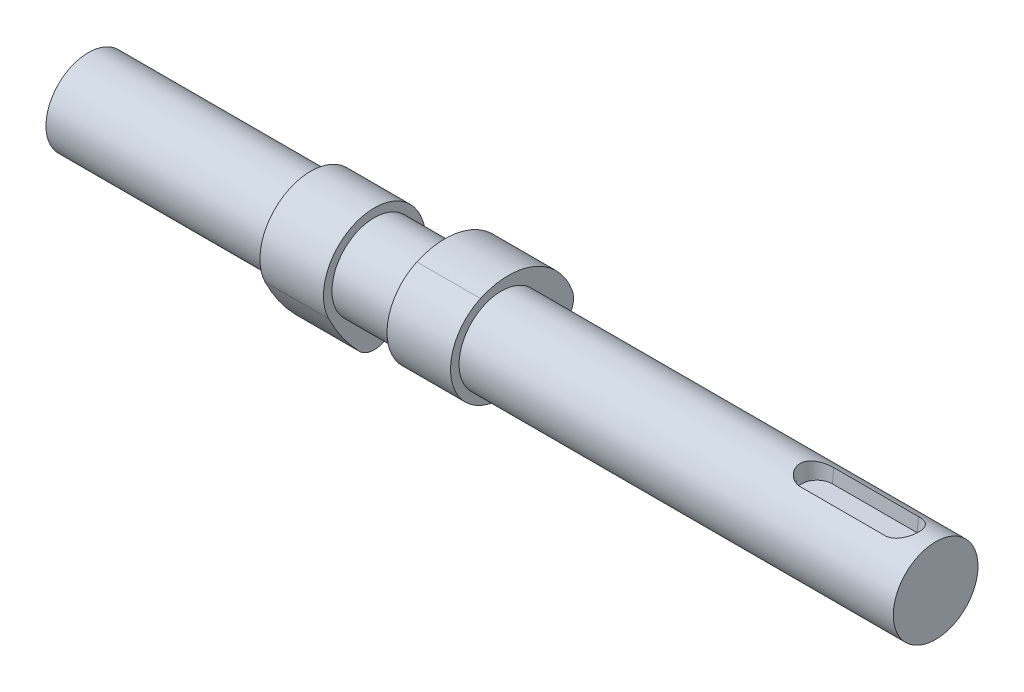
ISO-10303-21;
HEADER;
FILE_DESCRIPTION(('STEP AP214'),'2;1');
FILE_NAME('part.step','',(''),(''),'','','');
FILE_SCHEMA(('AUTOMOTIVE_DESIGN { 1 0 10303 214 1 1 1 1 }'));
ENDSEC;
DATA;
#1=APPLICATION_CONTEXT('core data for automotive mechanical design processes');
#2=APPLICATION_PROTOCOL_DEFINITION('international standard','automotive_design',2000,#1);
#3=PRODUCT_CONTEXT('',#1,'mechanical');
#4=PRODUCT('Part','Part','',(#3));
#5=PRODUCT_RELATED_PRODUCT_CATEGORY('part','',(#4));
#6=PRODUCT_DEFINITION_FORMATION('','',#4);
#7=PRODUCT_DEFINITION_CONTEXT('part definition',#1,'design');
#8=PRODUCT_DEFINITION('design','',#6,#7);
#9=PRODUCT_DEFINITION_SHAPE('','',#8);
#10=(LENGTH_UNIT() NAMED_UNIT(*) SI_UNIT(.MILLI.,.METRE.));
#11=(NAMED_UNIT(*) PLANE_ANGLE_UNIT() SI_UNIT($,.RADIAN.));
#12=(NAMED_UNIT(*) SI_UNIT($,.STERADIAN.) SOLID_ANGLE_UNIT());
#13=UNCERTAINTY_MEASURE_WITH_UNIT(LENGTH_MEASURE(1.E-05),#10,'distance_accuracy_value','');
#14=(GEOMETRIC_REPRESENTATION_CONTEXT(3) GLOBAL_UNCERTAINTY_ASSIGNED_CONTEXT((#13)) GLOBAL_UNIT_ASSIGNED_CONTEXT((#10,
#11,#12)) REPRESENTATION_CONTEXT('',''));
#15=CARTESIAN_POINT('',(0.,0.,0.));
#16=DIRECTION('',(0.,0.,1.));
#17=DIRECTION('',(1.,0.,0.));
#18=AXIS2_PLACEMENT_3D('',#15,#16,#17);
#19=CARTESIAN_POINT('',(-75.,0.,0.));
#20=DIRECTION('',(1.,0.,0.));
#21=DIRECTION('',(0.,-1.,0.));
#22=AXIS2_PLACEMENT_3D('',#19,#20,#21);
#23=PLANE('',#22);
#24=CARTESIAN_POINT('',(-75.,0.,0.));
#25=DIRECTION('',(1.,0.,0.));
#26=DIRECTION('',(0.,-1.,0.));
#27=AXIS2_PLACEMENT_3D('',#24,#25,#26);
#28=CIRCLE('',#27,10.);
#29=CARTESIAN_POINT('',(-75.,-10.,0.));
#30=VERTEX_POINT('',#29);
#31=EDGE_CURVE('E210',#30,#30,#28,.T.);
#32=ORIENTED_EDGE('',*,*,#31,.F.);
#33=EDGE_LOOP('',(#32));
#34=FACE_BOUND('',#33,.T.);
#35=ADVANCED_FACE('F42',(#34),#23,.F.);
#36=CARTESIAN_POINT('',(-75.,0.,0.));
#37=DIRECTION('',(1.,0.,0.));
#38=DIRECTION('',(0.,-1.,0.));
#39=AXIS2_PLACEMENT_3D('',#36,#37,#38);
#40=CYLINDRICAL_SURFACE('',#39,10.);
#41=ORIENTED_EDGE('',*,*,#31,.T.);
#42=EDGE_LOOP('',(#41));
#43=FACE_BOUND('',#42,.T.);
#44=CARTESIAN_POINT('',(-22.5,0.,0.));
#45=DIRECTION('',(1.,0.,0.));
#46=DIRECTION('',(0.,-1.,0.));
#47=AXIS2_PLACEMENT_3D('',#44,#45,#46);
#48=CIRCLE('',#47,10.);
#49=CARTESIAN_POINT('',(-22.5,-10.,0.));
#50=VERTEX_POINT('',#49);
#51=EDGE_CURVE('E207',#50,#50,#48,.F.);
#52=ORIENTED_EDGE('',*,*,#51,.T.);
#53=EDGE_LOOP('',(#52));
#54=FACE_BOUND('',#53,.T.);
#55=ADVANCED_FACE('F295',(#43,#54),#40,.T.);
#56=CARTESIAN_POINT('',(-22.5,-6.83976699708438,1.82185343142508));
#57=DIRECTION('',(1.,0.,0.));
#58=DIRECTION('',(0.,1.,0.));
#59=AXIS2_PLACEMENT_3D('',#56,#57,#58);
#60=PLANE('',#59);
#61=ORIENTED_EDGE('',*,*,#51,.F.);
#62=EDGE_LOOP('',(#61));
#63=FACE_BOUND('',#62,.T.);
#64=CARTESIAN_POINT('',(-22.5,-1.65027279490968,3.64370686285011));
#65=DIRECTION('',(1.,0.,0.));
#66=DIRECTION('',(0.,1.,0.));
#67=AXIS2_PLACEMENT_3D('',#64,#65,#66);
#68=CIRCLE('',#67,16.);
#69=CARTESIAN_POINT('',(-22.5,-16.7469832012361,-1.65623039220454));
#70=VERTEX_POINT('',#69);
#71=CARTESIAN_POINT('',(-22.5,4.95081838472903,-10.9311205885503));
#72=VERTEX_POINT('',#71);
#73=EDGE_CURVE('E226',#70,#72,#68,.T.);
#74=ORIENTED_EDGE('',*,*,#73,.F.);
#75=CARTESIAN_POINT('',(-22.5,-12.0292611992591,0.));
#76=DIRECTION('',(1.,0.,0.));
#77=DIRECTION('',(0.,1.,0.));
#78=AXIS2_PLACEMENT_3D('',#75,#76,#77);
#79=CIRCLE('',#78,5.);
#80=CARTESIAN_POINT('',(-22.5,-15.5071088248952,3.59229395969449));
#81=VERTEX_POINT('',#80);
#82=EDGE_CURVE('E240',#81,#70,#79,.T.);
#83=ORIENTED_EDGE('',*,*,#82,.F.);
#84=CARTESIAN_POINT('',(-22.5,12.3156721801937,-25.1460577178611));
#85=DIRECTION('',(1.,0.,0.));
#86=DIRECTION('',(0.,1.,0.));
#87=AXIS2_PLACEMENT_3D('',#84,#85,#86);
#88=CIRCLE('',#87,40.);
#89=CARTESIAN_POINT('',(-22.5,-5.27814522008302,10.7768818790833));
#90=VERTEX_POINT('',#89);
#91=EDGE_CURVE('E237',#90,#81,#88,.T.);
#92=ORIENTED_EDGE('',*,*,#91,.F.);
#93=CARTESIAN_POINT('',(-22.5,0.,0.));
#94=DIRECTION('',(1.,0.,0.));
#95=DIRECTION('',(0.,-1.,0.));
#96=AXIS2_PLACEMENT_3D('',#93,#94,#95);
#97=CIRCLE('',#96,12.);
#98=EDGE_CURVE('E221',#72,#90,#97,.T.);
#99=ORIENTED_EDGE('',*,*,#98,.F.);
#100=EDGE_LOOP('',(#74,#83,#92,#99));
#101=FACE_BOUND('',#100,.T.);
#102=ADVANCED_FACE('F300',(#63,#101),#60,.F.);
#103=CARTESIAN_POINT('',(-22.5,-12.0292611992591,0.));
#104=DIRECTION('',(1.,0.,0.));
#105=DIRECTION('',(0.,-1.,0.));
#106=AXIS2_PLACEMENT_3D('',#103,#104,#105);
#107=CYLINDRICAL_SURFACE('',#106,5.);
#108=CARTESIAN_POINT('',(-7.5,-12.0292611992591,0.));
#109=DIRECTION('',(1.,0.,0.));
#110=DIRECTION('',(0.,1.,0.));
#111=AXIS2_PLACEMENT_3D('',#108,#109,#110);
#112=CIRCLE('',#111,5.);
#113=CARTESIAN_POINT('',(-7.5,-15.5071088248952,3.59229395969449));
#114=VERTEX_POINT('',#113);
#115=CARTESIAN_POINT('',(-7.5,-16.7469832012361,-1.65623039220454));
#116=VERTEX_POINT('',#115);
#117=EDGE_CURVE('E229',#114,#116,#112,.T.);
#118=ORIENTED_EDGE('',*,*,#117,.F.);
#119=DIRECTION('',(1.,0.,0.));
#120=VECTOR('',#119,1.);
#121=CARTESIAN_POINT('',(-22.5,-15.5071088248952,3.59229395969449));
#122=LINE('',#121,#120);
#123=EDGE_CURVE('E216',#81,#114,#122,.T.);
#124=ORIENTED_EDGE('',*,*,#123,.F.);
#125=ORIENTED_EDGE('',*,*,#82,.T.);
#126=DIRECTION('',(1.,0.,0.));
#127=VECTOR('',#126,1.);
#128=CARTESIAN_POINT('',(-22.5,-16.7469832012361,-1.65623039220454));
#129=LINE('',#128,#127);
#130=EDGE_CURVE('E65',#70,#116,#129,.T.);
#131=ORIENTED_EDGE('',*,*,#130,.T.);
#132=EDGE_LOOP('',(#118,#124,#125,#131));
#133=FACE_BOUND('',#132,.T.);
#134=ADVANCED_FACE('F309',(#133),#107,.T.);
#135=CARTESIAN_POINT('',(-22.5,12.3156721801937,-25.1460577178611));
#136=DIRECTION('',(1.,0.,0.));
#137=DIRECTION('',(0.,-1.,0.));
#138=AXIS2_PLACEMENT_3D('',#135,#136,#137);
#139=CYLINDRICAL_SURFACE('',#138,40.);
#140=CARTESIAN_POINT('',(-7.5,12.3156721801937,-25.1460577178611));
#141=DIRECTION('',(1.,0.,0.));
#142=DIRECTION('',(0.,1.,0.));
#143=AXIS2_PLACEMENT_3D('',#140,#141,#142);
#144=CIRCLE('',#143,40.);
#145=CARTESIAN_POINT('',(-7.5,-5.27814522008302,10.7768818790833));
#146=VERTEX_POINT('',#145);
#147=EDGE_CURVE('E225',#146,#114,#144,.T.);
#148=ORIENTED_EDGE('',*,*,#147,.F.);
#149=DIRECTION('',(1.,0.,0.));
#150=VECTOR('',#149,1.);
#151=CARTESIAN_POINT('',(-22.5,-5.27814522008302,10.7768818790833));
#152=LINE('',#151,#150);
#153=EDGE_CURVE('E218',#90,#146,#152,.T.);
#154=ORIENTED_EDGE('',*,*,#153,.F.);
#155=ORIENTED_EDGE('',*,*,#91,.T.);
#156=ORIENTED_EDGE('',*,*,#123,.T.);
#157=EDGE_LOOP('',(#148,#154,#155,#156));
#158=FACE_BOUND('',#157,.T.);
#159=ADVANCED_FACE('F312',(#158),#139,.T.);
#160=CARTESIAN_POINT('',(-22.5,0.,0.));
#161=DIRECTION('',(1.,0.,0.));
#162=DIRECTION('',(0.,-1.,0.));
#163=AXIS2_PLACEMENT_3D('',#160,#161,#162);
#164=CYLINDRICAL_SURFACE('',#163,12.);
#165=CARTESIAN_POINT('',(-7.5,0.,0.));
#166=DIRECTION('',(1.,0.,0.));
#167=DIRECTION('',(0.,-1.,0.));
#168=AXIS2_PLACEMENT_3D('',#165,#166,#167);
#169=CIRCLE('',#168,12.);
#170=CARTESIAN_POINT('',(-7.5,4.95081838472903,-10.9311205885503));
#171=VERTEX_POINT('',#170);
#172=EDGE_CURVE('E222',#171,#146,#169,.T.);
#173=ORIENTED_EDGE('',*,*,#172,.F.);
#174=DIRECTION('',(1.,0.,0.));
#175=VECTOR('',#174,1.);
#176=CARTESIAN_POINT('',(-22.5,4.95081838472903,-10.9311205885503));
#177=LINE('',#176,#175);
#178=EDGE_CURVE('E88',#72,#171,#177,.T.);
#179=ORIENTED_EDGE('',*,*,#178,.F.);
#180=ORIENTED_EDGE('',*,*,#98,.T.);
#181=ORIENTED_EDGE('',*,*,#153,.T.);
#182=EDGE_LOOP('',(#173,#179,#180,#181));
#183=FACE_BOUND('',#182,.T.);
#184=ADVANCED_FACE('F308',(#183),#164,.T.);
#185=CARTESIAN_POINT('',(-22.5,-1.65027279490968,3.64370686285011));
#186=DIRECTION('',(1.,0.,0.));
#187=DIRECTION('',(0.,-1.,0.));
#188=AXIS2_PLACEMENT_3D('',#185,#186,#187);
#189=CYLINDRICAL_SURFACE('',#188,16.);
#190=CARTESIAN_POINT('',(-7.5,-1.65027279490968,3.64370686285011));
#191=DIRECTION('',(1.,0.,0.));
#192=DIRECTION('',(0.,1.,0.));
#193=AXIS2_PLACEMENT_3D('',#190,#191,#192);
#194=CIRCLE('',#193,16.);
#195=EDGE_CURVE('E232',#116,#171,#194,.T.);
#196=ORIENTED_EDGE('',*,*,#195,.F.);
#197=ORIENTED_EDGE('',*,*,#130,.F.);
#198=ORIENTED_EDGE('',*,*,#73,.T.);
#199=ORIENTED_EDGE('',*,*,#178,.T.);
#200=EDGE_LOOP('',(#196,#197,#198,#199));
#201=FACE_BOUND('',#200,.T.);
#202=ADVANCED_FACE('F304',(#201),#189,.T.);
#203=CARTESIAN_POINT('',(-7.5,-6.83976699708438,1.82185343142508));
#204=DIRECTION('',(1.,0.,0.));
#205=DIRECTION('',(0.,1.,0.));
#206=AXIS2_PLACEMENT_3D('',#203,#204,#205);
#207=PLANE('',#206);
#208=CARTESIAN_POINT('',(-7.49999999999999,0.,0.));
#209=DIRECTION('',(1.,0.,0.));
#210=DIRECTION('',(0.,-1.,0.));
#211=AXIS2_PLACEMENT_3D('',#208,#209,#210);
#212=CIRCLE('',#211,10.);
#213=CARTESIAN_POINT('',(-7.49999999999999,-10.,0.));
#214=VERTEX_POINT('',#213);
#215=EDGE_CURVE('E204',#214,#214,#212,.F.);
#216=ORIENTED_EDGE('',*,*,#215,.T.);
#217=EDGE_LOOP('',(#216));
#218=FACE_BOUND('',#217,.T.);
#219=ORIENTED_EDGE('',*,*,#195,.T.);
#220=ORIENTED_EDGE('',*,*,#172,.T.);
#221=ORIENTED_EDGE('',*,*,#147,.T.);
#222=ORIENTED_EDGE('',*,*,#117,.T.);
#223=EDGE_LOOP('',(#219,#220,#221,#222));
#224=FACE_BOUND('',#223,.T.);
#225=ADVANCED_FACE('F307',(#218,#224),#207,.T.);
#226=ORIENTED_EDGE('',*,*,#215,.F.);
#227=EDGE_LOOP('',(#226));
#228=FACE_BOUND('',#227,.T.);
#229=CARTESIAN_POINT('',(7.49999999999999,0.,0.));
#230=DIRECTION('',(-1.,0.,0.));
#231=DIRECTION('',(0.,0.,1.));
#232=AXIS2_PLACEMENT_3D('',#229,#230,#231);
#233=CIRCLE('',#232,10.);
#234=CARTESIAN_POINT('',(7.49999999999999,0.,10.));
#235=VERTEX_POINT('',#234);
#236=EDGE_CURVE('E201',#235,#235,#233,.F.);
#237=ORIENTED_EDGE('',*,*,#236,.F.);
#238=EDGE_LOOP('',(#237));
#239=FACE_BOUND('',#238,.T.);
#240=ADVANCED_FACE('F44',(#228,#239),#40,.T.);
#241=CARTESIAN_POINT('',(-75.,0.,0.));
#242=DIRECTION('',(1.,0.,0.));
#243=DIRECTION('',(0.,0.,-1.));
#244=AXIS2_PLACEMENT_3D('',#241,#242,#243);
#245=CYLINDRICAL_SURFACE('',#244,10.);
#246=CARTESIAN_POINT('',(116.9998,9.19554732162667,3.92961950520972));
#247=CARTESIAN_POINT('',(117.108432526229,9.19552396461699,3.92963900895938));
#248=CARTESIAN_POINT('',(117.217054442407,9.19739790113637,3.92528821148888));
#249=CARTESIAN_POINT('',(117.433449189068,9.20478322107422,3.90795696349252));
#250=CARTESIAN_POINT('',(117.541222281507,9.21029343390919,3.89497929010512));
#251=CARTESIAN_POINT('',(117.754805249896,9.22477014169951,3.86056266999496));
#252=CARTESIAN_POINT('',(117.860620479704,9.23372503404509,3.83915212174359));
#253=CARTESIAN_POINT('',(118.069896437043,9.25479066145063,3.78808770588497));
#254=CARTESIAN_POINT('',(118.173357048389,9.26690155187349,3.75843343245227));
#255=CARTESIAN_POINT('',(118.478997114603,9.30741193624863,3.65751207972482));
#256=CARTESIAN_POINT('',(118.676801412905,9.34001597020544,3.57422665843843));
#257=CARTESIAN_POINT('',(119.055656727802,9.41272444967854,3.37809141880251));
#258=CARTESIAN_POINT('',(119.236694043575,9.45283494952219,3.26521770641159));
#259=CARTESIAN_POINT('',(119.586163210606,9.53832850590639,3.00660395270599));
#260=CARTESIAN_POINT('',(119.75359745749,9.58387103250205,2.85956460575029));
#261=CARTESIAN_POINT('',(120.06167183687,9.67365894564606,2.53928149200147));
#262=CARTESIAN_POINT('',(120.202307528385,9.7179041161741,2.36603339048636));
#263=CARTESIAN_POINT('',(120.455271105667,9.80118313396661,1.99346714637655));
#264=CARTESIAN_POINT('',(120.566978377658,9.8400954262747,1.79369791629398));
#265=CARTESIAN_POINT('',(120.754126120008,9.90710575454471,1.37616732968246));
#266=CARTESIAN_POINT('',(120.829586514252,9.93520972983523,1.15841593476275));
#267=CARTESIAN_POINT('',(120.937423647946,9.97586398416612,0.72555222212956));
#268=CARTESIAN_POINT('',(120.972183980034,9.98927144663287,0.511115107829934));
#269=CARTESIAN_POINT('',(121.005253036647,10.0020189726074,0.0790606490660713));
#270=CARTESIAN_POINT('',(121.003575139474,10.0013641990691,-0.138555498890742));
#271=CARTESIAN_POINT('',(120.965065772481,9.98653634618633,-0.557134377313778));
#272=CARTESIAN_POINT('',(120.930314495065,9.97316323800987,-0.758322063329798));
#273=CARTESIAN_POINT('',(120.830073130865,9.93541593559446,-1.15177617887117));
#274=CARTESIAN_POINT('',(120.764581003034,9.91104101089147,-1.34404201509667));
#275=CARTESIAN_POINT('',(120.603676754373,9.8530923067776,-1.71848117040826));
#276=CARTESIAN_POINT('',(120.50772071095,9.81935282430629,-1.90039390354835));
#277=CARTESIAN_POINT('',(120.289247885583,9.74606742103519,-2.246210811776));
#278=CARTESIAN_POINT('',(120.166721786218,9.70651946492988,-2.41010863904957));
#279=CARTESIAN_POINT('',(119.888474496445,9.62225347352947,-2.7278550736791));
#280=CARTESIAN_POINT('',(119.730991599461,9.57736844831364,-2.88011561690001));
#281=CARTESIAN_POINT('',(119.39269852426,9.48965886456742,-3.15714116902367));
#282=CARTESIAN_POINT('',(119.211877236817,9.44683530072072,-3.28189300651247));
#283=CARTESIAN_POINT('',(118.922606169477,9.38686542506334,-3.44824964477365));
#284=CARTESIAN_POINT('',(118.820957447824,9.36724202522513,-3.50106618947219));
#285=CARTESIAN_POINT('',(118.613181248028,9.33044058072898,-3.5979946757925));
#286=CARTESIAN_POINT('',(118.507055578203,9.31326156077457,-3.64211009185353));
#287=CARTESIAN_POINT('',(118.291154422689,9.28193522243321,-3.72122180241614));
#288=CARTESIAN_POINT('',(118.181382861742,9.26778475870701,-3.75622756608453));
#289=CARTESIAN_POINT('',(117.958933082548,9.24298582877054,-3.81684131432378));
#290=CARTESIAN_POINT('',(117.846256085105,9.23233591674958,-3.8424531793048));
#291=CARTESIAN_POINT('',(117.611930809076,9.21440060696265,-3.88528372873352));
#292=CARTESIAN_POINT('',(117.490152858103,9.20735840438907,-3.90189924806992));
#293=CARTESIAN_POINT('',(117.245519514609,9.19791466072453,-3.92407823700824));
#294=CARTESIAN_POINT('',(117.122665085282,9.19550932696913,-3.92965073920191));
#295=CARTESIAN_POINT('',(116.9998,9.19554732162667,-3.92961950520972));
#296=B_SPLINE_CURVE_WITH_KNOTS('',3,(#246,#247,#248,#249,#250,#251,#252,#253,#254,#255,#256,
#257,#258,#259,#260,#261,#262,#263,#264,#265,#266,#267,#268,#269,#270,#271,#272,#273,#274,#275,
#276,#277,#278,#279,#280,#281,#282,#283,#284,#285,#286,#287,#288,#289,#290,#291,#292,#293,#294,
#295),.UNSPECIFIED.,.F.,.F.,(4,2,2,2,2,2,2,2,2,2,2,2,2,2,2,2,2,2,2,2,2,2,2,2,4),(0.,
0.325775853756532,0.651446885464914,0.976030440919044,1.3006299779342,1.94872565760357,
2.59734632832017,3.27656669617222,3.9558995248008,4.64878303442881,5.34128524851461,
5.99080148182277,6.64007924914105,7.25104428619564,7.86204989415493,8.48464423808042,
9.10745726360786,9.77538752835235,10.4436369129641,10.7919327546046,11.1400892357431,
11.4878823615824,11.8355316596004,12.2042630896941,12.5726927926964),.UNSPECIFIED.);
#297=CARTESIAN_POINT('',(117.,9.19554731953009,3.92961951011584));
#298=VERTEX_POINT('',#297);
#299=CARTESIAN_POINT('',(117.,9.19554731953009,-3.92961951011584));
#300=VERTEX_POINT('',#299);
#301=EDGE_CURVE('E234',#298,#300,#296,.T.);
#302=ORIENTED_EDGE('',*,*,#301,.F.);
#303=DIRECTION('',(1.,0.,0.));
#304=VECTOR('',#303,1.);
#305=CARTESIAN_POINT('',(-75.,9.19554731953009,3.92961951011584));
#306=LINE('',#305,#304);
#307=CARTESIAN_POINT('',(97.,9.19554731953009,3.92961951011584));
#308=VERTEX_POINT('',#307);
#309=EDGE_CURVE('E11',#308,#298,#306,.T.);
#310=ORIENTED_EDGE('',*,*,#309,.F.);
#311=CARTESIAN_POINT('',(97.0002,9.19554732162667,-3.92961950520972));
#312=CARTESIAN_POINT('',(96.8915674737709,9.19552396461699,-3.92963900895938));
#313=CARTESIAN_POINT('',(96.7829455575925,9.19739790113637,-3.92528821148888));
#314=CARTESIAN_POINT('',(96.5665508109321,9.20478322107422,-3.90795696349252));
#315=CARTESIAN_POINT('',(96.4587777184928,9.21029343390919,-3.89497929010512));
#316=CARTESIAN_POINT('',(96.2451947501037,9.22477014169951,-3.86056266999496));
#317=CARTESIAN_POINT('',(96.1393795202961,9.23372503404509,-3.8391521217436));
#318=CARTESIAN_POINT('',(95.9301035629571,9.25479066145062,-3.78808770588497));
#319=CARTESIAN_POINT('',(95.8266429516112,9.26690155187349,-3.75843343245228));
#320=CARTESIAN_POINT('',(95.5210028853967,9.30741193624863,-3.65751207972482));
#321=CARTESIAN_POINT('',(95.3231985870946,9.34001597020544,-3.57422665843843));
#322=CARTESIAN_POINT('',(94.9443432721979,9.41272444967854,-3.37809141880251));
#323=CARTESIAN_POINT('',(94.7633059564248,9.45283494952219,-3.26521770641159));
#324=CARTESIAN_POINT('',(94.413836789394,9.53832850590639,-3.00660395270599));
#325=CARTESIAN_POINT('',(94.2464025425101,9.58387103250205,-2.85956460575029));
#326=CARTESIAN_POINT('',(93.9383281631304,9.67365894564606,-2.53928149200147));
#327=CARTESIAN_POINT('',(93.7976924716152,9.7179041161741,-2.36603339048636));
#328=CARTESIAN_POINT('',(93.544728894333,9.80118313396661,-1.99346714637655));
#329=CARTESIAN_POINT('',(93.4330216223424,9.84009542627471,-1.79369791629397));
#330=CARTESIAN_POINT('',(93.2458738799919,9.90710575454472,-1.37616732968246));
#331=CARTESIAN_POINT('',(93.1704134857481,9.93520972983524,-1.15841593476275));
#332=CARTESIAN_POINT('',(93.0625763520545,9.97586398416612,-0.72555222212956));
#333=CARTESIAN_POINT('',(93.0278160199655,9.98927144663287,-0.511115107829935));
#334=CARTESIAN_POINT('',(92.9947469633532,10.0020189726074,-0.079060649066072));
#335=CARTESIAN_POINT('',(92.9964248605263,10.0013641990691,0.138555498890742));
#336=CARTESIAN_POINT('',(93.0349342275193,9.98653634618633,0.557134377313778));
#337=CARTESIAN_POINT('',(93.0696855049347,9.97316323800987,0.758322063329798));
#338=CARTESIAN_POINT('',(93.1699268691349,9.93541593559446,1.15177617887117));
#339=CARTESIAN_POINT('',(93.2354189969656,9.91104101089147,1.34404201509667));
#340=CARTESIAN_POINT('',(93.3963232456273,9.8530923067776,1.71848117040827));
#341=CARTESIAN_POINT('',(93.4922792890503,9.81935282430629,1.90039390354835));
#342=CARTESIAN_POINT('',(93.7107521144166,9.74606742103519,2.246210811776));
#343=CARTESIAN_POINT('',(93.8332782137822,9.70651946492988,2.41010863904957));
#344=CARTESIAN_POINT('',(94.1115255035547,9.62225347352947,2.7278550736791));
#345=CARTESIAN_POINT('',(94.2690084005388,9.57736844831365,2.88011561690001));
#346=CARTESIAN_POINT('',(94.6073014757403,9.48965886456742,3.15714116902367));
#347=CARTESIAN_POINT('',(94.7881227631832,9.44683530072072,3.28189300651247));
#348=CARTESIAN_POINT('',(95.0773938305227,9.38686542506334,3.44824964477365));
#349=CARTESIAN_POINT('',(95.1790425521757,9.36724202522513,3.50106618947219));
#350=CARTESIAN_POINT('',(95.386818751972,9.33044058072897,3.5979946757925));
#351=CARTESIAN_POINT('',(95.4929444217969,9.31326156077457,3.64211009185354));
#352=CARTESIAN_POINT('',(95.7088455773114,9.28193522243321,3.72122180241614));
#353=CARTESIAN_POINT('',(95.8186171382581,9.26778475870701,3.75622756608453));
#354=CARTESIAN_POINT('',(96.0410669174523,9.24298582877054,3.81684131432378));
#355=CARTESIAN_POINT('',(96.1537439148955,9.23233591674958,3.84245317930481));
#356=CARTESIAN_POINT('',(96.388069190924,9.21440060696265,3.88528372873352));
#357=CARTESIAN_POINT('',(96.5098471418972,9.20735840438907,3.90189924806992));
#358=CARTESIAN_POINT('',(96.7544804853914,9.19791466072453,3.92407823700823));
#359=CARTESIAN_POINT('',(96.8773349147178,9.19550932696913,3.92965073920191));
#360=CARTESIAN_POINT('',(97.0002,9.19554732162667,3.92961950520972));
#361=B_SPLINE_CURVE_WITH_KNOTS('',3,(#311,#312,#313,#314,#315,#316,#317,#318,#319,#320,#321,
#322,#323,#324,#325,#326,#327,#328,#329,#330,#331,#332,#333,#334,#335,#336,#337,#338,#339,#340,
#341,#342,#343,#344,#345,#346,#347,#348,#349,#350,#351,#352,#353,#354,#355,#356,#357,#358,#359,
#360),.UNSPECIFIED.,.F.,.F.,(4,2,2,2,2,2,2,2,2,2,2,2,2,2,2,2,2,2,2,2,2,2,2,2,4),(0.,
0.325775853756532,0.6514468854649,0.976030440919029,1.3006299779342,1.94872565760357,
2.59734632832017,3.27656669617222,3.9558995248008,4.64878303442882,5.34128524851461,
5.99080148182277,6.64007924914105,7.25104428619564,7.86204989415494,8.48464423808043,
9.10745726360786,9.77538752835234,10.4436369129641,10.7919327546046,11.1400892357431,
11.4878823615824,11.8355316596004,12.204263089694,12.5726927926964),.UNSPECIFIED.);
#362=CARTESIAN_POINT('',(97.,9.19554731953009,-3.92961951011584));
#363=VERTEX_POINT('',#362);
#364=EDGE_CURVE('E50',#363,#308,#361,.T.);
#365=ORIENTED_EDGE('',*,*,#364,.F.);
#366=DIRECTION('',(1.,0.,0.));
#367=VECTOR('',#366,1.);
#368=CARTESIAN_POINT('',(-75.,9.19554731953009,-3.92961951011584));
#369=LINE('',#368,#367);
#370=EDGE_CURVE('E145',#300,#363,#369,.F.);
#371=ORIENTED_EDGE('',*,*,#370,.F.);
#372=EDGE_LOOP('',(#302,#310,#365,#371));
#373=FACE_BOUND('',#372,.T.);
#374=CARTESIAN_POINT('',(125.,0.,0.));
#375=DIRECTION('',(1.,0.,0.));
#376=DIRECTION('',(0.,0.,-1.));
#377=AXIS2_PLACEMENT_3D('',#374,#375,#376);
#378=CIRCLE('',#377,10.);
#379=CARTESIAN_POINT('',(125.,0.,-10.));
#380=VERTEX_POINT('',#379);
#381=EDGE_CURVE('E198',#380,#380,#378,.T.);
#382=ORIENTED_EDGE('',*,*,#381,.F.);
#383=EDGE_LOOP('',(#382));
#384=FACE_BOUND('',#383,.T.);
#385=CARTESIAN_POINT('',(22.5,0.,0.));
#386=DIRECTION('',(-1.,0.,0.));
#387=DIRECTION('',(0.,0.,1.));
#388=AXIS2_PLACEMENT_3D('',#385,#386,#387);
#389=CIRCLE('',#388,10.);
#390=CARTESIAN_POINT('',(22.5,0.,10.));
#391=VERTEX_POINT('',#390);
#392=EDGE_CURVE('E197',#391,#391,#389,.F.);
#393=ORIENTED_EDGE('',*,*,#392,.T.);
#394=EDGE_LOOP('',(#393));
#395=FACE_BOUND('',#394,.T.);
#396=ADVANCED_FACE('F250',(#373,#384,#395),#245,.T.);
#397=CARTESIAN_POINT('',(125.,0.,0.));
#398=DIRECTION('',(1.,0.,0.));
#399=DIRECTION('',(0.,0.,-1.));
#400=AXIS2_PLACEMENT_3D('',#397,#398,#399);
#401=PLANE('',#400);
#402=ORIENTED_EDGE('',*,*,#381,.T.);
#403=EDGE_LOOP('',(#402));
#404=FACE_BOUND('',#403,.T.);
#405=ADVANCED_FACE('F286',(#404),#401,.T.);
#406=CARTESIAN_POINT('',(22.5,-3.64370686285011,-1.65027279490969));
#407=DIRECTION('',(-1.,0.,0.));
#408=DIRECTION('',(0.,0.,1.));
#409=AXIS2_PLACEMENT_3D('',#406,#407,#408);
#410=CYLINDRICAL_SURFACE('',#409,16.);
#411=CARTESIAN_POINT('',(7.5,-3.64370686285011,-1.65027279490969));
#412=DIRECTION('',(1.,0.,0.));
#413=DIRECTION('',(0.,0.,1.));
#414=AXIS2_PLACEMENT_3D('',#411,#412,#413);
#415=CIRCLE('',#414,16.);
#416=CARTESIAN_POINT('',(7.5,1.65623039220459,-16.7469832012361));
#417=VERTEX_POINT('',#416);
#418=CARTESIAN_POINT('',(7.5,10.9311205885503,4.95081838472907));
#419=VERTEX_POINT('',#418);
#420=EDGE_CURVE('E147',#417,#419,#415,.T.);
#421=ORIENTED_EDGE('',*,*,#420,.T.);
#422=DIRECTION('',(-1.,0.,0.));
#423=VECTOR('',#422,1.);
#424=CARTESIAN_POINT('',(22.5,10.9311205885503,4.95081838472907));
#425=LINE('',#424,#423);
#426=CARTESIAN_POINT('',(22.5,10.9311205885503,4.95081838472907));
#427=VERTEX_POINT('',#426);
#428=EDGE_CURVE('E194',#427,#419,#425,.T.);
#429=ORIENTED_EDGE('',*,*,#428,.F.);
#430=CARTESIAN_POINT('',(22.5,-3.64370686285011,-1.65027279490969));
#431=DIRECTION('',(1.,0.,0.));
#432=DIRECTION('',(0.,0.,1.));
#433=AXIS2_PLACEMENT_3D('',#430,#431,#432);
#434=CIRCLE('',#433,16.);
#435=CARTESIAN_POINT('',(22.5,1.65623039220459,-16.7469832012361));
#436=VERTEX_POINT('',#435);
#437=EDGE_CURVE('E168',#436,#427,#434,.T.);
#438=ORIENTED_EDGE('',*,*,#437,.F.);
#439=DIRECTION('',(-1.,0.,0.));
#440=VECTOR('',#439,1.);
#441=CARTESIAN_POINT('',(22.5,1.65623039220459,-16.7469832012361));
#442=LINE('',#441,#440);
#443=EDGE_CURVE('E178',#436,#417,#442,.T.);
#444=ORIENTED_EDGE('',*,*,#443,.T.);
#445=EDGE_LOOP('',(#421,#429,#438,#444));
#446=FACE_BOUND('',#445,.T.);
#447=ADVANCED_FACE('F283',(#446),#410,.T.);
#448=CARTESIAN_POINT('',(22.5,0.,0.));
#449=DIRECTION('',(-1.,0.,0.));
#450=DIRECTION('',(0.,0.,1.));
#451=AXIS2_PLACEMENT_3D('',#448,#449,#450);
#452=CYLINDRICAL_SURFACE('',#451,12.);
#453=CARTESIAN_POINT('',(7.5,0.,0.));
#454=DIRECTION('',(1.,0.,0.));
#455=DIRECTION('',(0.,0.,-1.));
#456=AXIS2_PLACEMENT_3D('',#453,#454,#455);
#457=CIRCLE('',#456,12.);
#458=CARTESIAN_POINT('',(7.5,-10.7768818790833,-5.27814522008306));
#459=VERTEX_POINT('',#458);
#460=EDGE_CURVE('E181',#419,#459,#457,.T.);
#461=ORIENTED_EDGE('',*,*,#460,.T.);
#462=DIRECTION('',(-1.,0.,0.));
#463=VECTOR('',#462,1.);
#464=CARTESIAN_POINT('',(22.5,-10.7768818790833,-5.27814522008306));
#465=LINE('',#464,#463);
#466=CARTESIAN_POINT('',(22.5,-10.7768818790833,-5.27814522008306));
#467=VERTEX_POINT('',#466);
#468=EDGE_CURVE('E191',#467,#459,#465,.T.);
#469=ORIENTED_EDGE('',*,*,#468,.F.);
#470=CARTESIAN_POINT('',(22.5,0.,0.));
#471=DIRECTION('',(1.,0.,0.));
#472=DIRECTION('',(0.,0.,-1.));
#473=AXIS2_PLACEMENT_3D('',#470,#471,#472);
#474=CIRCLE('',#473,12.);
#475=EDGE_CURVE('E171',#427,#467,#474,.T.);
#476=ORIENTED_EDGE('',*,*,#475,.F.);
#477=ORIENTED_EDGE('',*,*,#428,.T.);
#478=EDGE_LOOP('',(#461,#469,#476,#477));
#479=FACE_BOUND('',#478,.T.);
#480=ADVANCED_FACE('F279',(#479),#452,.T.);
#481=CARTESIAN_POINT('',(22.5,25.1460577178611,12.3156721801938));
#482=DIRECTION('',(-1.,0.,0.));
#483=DIRECTION('',(0.,0.,1.));
#484=AXIS2_PLACEMENT_3D('',#481,#482,#483);
#485=CYLINDRICAL_SURFACE('',#484,40.);
#486=CARTESIAN_POINT('',(7.5,25.1460577178611,12.3156721801938));
#487=DIRECTION('',(1.,0.,0.));
#488=DIRECTION('',(0.,0.,1.));
#489=AXIS2_PLACEMENT_3D('',#486,#487,#488);
#490=CIRCLE('',#489,40.);
#491=CARTESIAN_POINT('',(7.5,-3.59229395969443,-15.5071088248952));
#492=VERTEX_POINT('',#491);
#493=EDGE_CURVE('E183',#459,#492,#490,.T.);
#494=ORIENTED_EDGE('',*,*,#493,.T.);
#495=DIRECTION('',(-1.,0.,0.));
#496=VECTOR('',#495,1.);
#497=CARTESIAN_POINT('',(22.5,-3.59229395969443,-15.5071088248952));
#498=LINE('',#497,#496);
#499=CARTESIAN_POINT('',(22.5,-3.59229395969443,-15.5071088248952));
#500=VERTEX_POINT('',#499);
#501=EDGE_CURVE('E188',#500,#492,#498,.T.);
#502=ORIENTED_EDGE('',*,*,#501,.F.);
#503=CARTESIAN_POINT('',(22.5,25.1460577178611,12.3156721801938));
#504=DIRECTION('',(1.,0.,0.));
#505=DIRECTION('',(0.,0.,1.));
#506=AXIS2_PLACEMENT_3D('',#503,#504,#505);
#507=CIRCLE('',#506,40.);
#508=EDGE_CURVE('E174',#467,#500,#507,.T.);
#509=ORIENTED_EDGE('',*,*,#508,.F.);
#510=ORIENTED_EDGE('',*,*,#468,.T.);
#511=EDGE_LOOP('',(#494,#502,#509,#510));
#512=FACE_BOUND('',#511,.T.);
#513=ADVANCED_FACE('F275',(#512),#485,.T.);
#514=CARTESIAN_POINT('',(22.5,0.,-12.0292611992591));
#515=DIRECTION('',(-1.,0.,0.));
#516=DIRECTION('',(0.,0.,1.));
#517=AXIS2_PLACEMENT_3D('',#514,#515,#516);
#518=CYLINDRICAL_SURFACE('',#517,5.);
#519=CARTESIAN_POINT('',(7.5,0.,-12.0292611992591));
#520=DIRECTION('',(1.,0.,0.));
#521=DIRECTION('',(0.,0.,1.));
#522=AXIS2_PLACEMENT_3D('',#519,#520,#521);
#523=CIRCLE('',#522,5.);
#524=EDGE_CURVE('E172',#492,#417,#523,.T.);
#525=ORIENTED_EDGE('',*,*,#524,.T.);
#526=ORIENTED_EDGE('',*,*,#443,.F.);
#527=CARTESIAN_POINT('',(22.5,0.,-12.0292611992591));
#528=DIRECTION('',(1.,0.,0.));
#529=DIRECTION('',(0.,0.,1.));
#530=AXIS2_PLACEMENT_3D('',#527,#528,#529);
#531=CIRCLE('',#530,5.);
#532=EDGE_CURVE('E176',#500,#436,#531,.T.);
#533=ORIENTED_EDGE('',*,*,#532,.F.);
#534=ORIENTED_EDGE('',*,*,#501,.T.);
#535=EDGE_LOOP('',(#525,#526,#533,#534));
#536=FACE_BOUND('',#535,.T.);
#537=ADVANCED_FACE('F268',(#536),#518,.T.);
#538=CARTESIAN_POINT('',(22.5,-1.82185343142505,-6.83976699708438));
#539=DIRECTION('',(-1.,0.,0.));
#540=DIRECTION('',(0.,0.,1.));
#541=AXIS2_PLACEMENT_3D('',#538,#539,#540);
#542=PLANE('',#541);
#543=ORIENTED_EDGE('',*,*,#392,.F.);
#544=EDGE_LOOP('',(#543));
#545=FACE_BOUND('',#544,.T.);
#546=ORIENTED_EDGE('',*,*,#437,.T.);
#547=ORIENTED_EDGE('',*,*,#475,.T.);
#548=ORIENTED_EDGE('',*,*,#508,.T.);
#549=ORIENTED_EDGE('',*,*,#532,.T.);
#550=EDGE_LOOP('',(#546,#547,#548,#549));
#551=FACE_BOUND('',#550,.T.);
#552=ADVANCED_FACE('F264',(#545,#551),#542,.F.);
#553=CARTESIAN_POINT('',(7.5,-1.82185343142505,-6.83976699708438));
#554=DIRECTION('',(-1.,0.,0.));
#555=DIRECTION('',(0.,0.,1.));
#556=AXIS2_PLACEMENT_3D('',#553,#554,#555);
#557=PLANE('',#556);
#558=ORIENTED_EDGE('',*,*,#236,.T.);
#559=EDGE_LOOP('',(#558));
#560=FACE_BOUND('',#559,.T.);
#561=ORIENTED_EDGE('',*,*,#420,.F.);
#562=ORIENTED_EDGE('',*,*,#524,.F.);
#563=ORIENTED_EDGE('',*,*,#493,.F.);
#564=ORIENTED_EDGE('',*,*,#460,.F.);
#565=EDGE_LOOP('',(#561,#562,#563,#564));
#566=FACE_BOUND('',#565,.T.);
#567=ADVANCED_FACE('F267',(#560,#566),#557,.T.);
#568=CARTESIAN_POINT('',(97.,10.,0.));
#569=DIRECTION('',(0.,1.,0.));
#570=DIRECTION('',(0.,0.,1.));
#571=AXIS2_PLACEMENT_3D('',#568,#569,#570);
#572=CONICAL_SURFACE('',#571,4.,0.0872664625997167);
#573=DIRECTION('',(0.,0.996194698091745,-0.0871557427476584));
#574=VECTOR('',#573,1.);
#575=CARTESIAN_POINT('',(97.,10.,-4.));
#576=LINE('',#575,#574);
#577=CARTESIAN_POINT('',(97.,6.,-3.6500453458963));
#578=VERTEX_POINT('',#577);
#579=EDGE_CURVE('E138',#578,#363,#576,.T.);
#580=ORIENTED_EDGE('',*,*,#579,.T.);
#581=ORIENTED_EDGE('',*,*,#364,.T.);
#582=DIRECTION('',(0.,0.996194698091745,0.0871557427476584));
#583=VECTOR('',#582,1.);
#584=CARTESIAN_POINT('',(97.,10.,4.));
#585=LINE('',#584,#583);
#586=CARTESIAN_POINT('',(97.,6.,3.6500453458963));
#587=VERTEX_POINT('',#586);
#588=EDGE_CURVE('E56',#587,#308,#585,.T.);
#589=ORIENTED_EDGE('',*,*,#588,.F.);
#590=CARTESIAN_POINT('',(97.,6.,0.));
#591=DIRECTION('',(0.,1.,0.));
#592=DIRECTION('',(0.,0.,1.));
#593=AXIS2_PLACEMENT_3D('',#590,#591,#592);
#594=CIRCLE('',#593,3.6500453458963);
#595=EDGE_CURVE('E151',#578,#587,#594,.T.);
#596=ORIENTED_EDGE('',*,*,#595,.F.);
#597=EDGE_LOOP('',(#580,#581,#589,#596));
#598=FACE_BOUND('',#597,.T.);
#599=ADVANCED_FACE('F152',(#598),#572,.F.);
#600=CARTESIAN_POINT('',(97.,10.,-4.));
#601=DIRECTION('',(0.,-0.0871557427476584,-0.996194698091746));
#602=DIRECTION('',(0.,0.996194698091746,-0.0871557427476584));
#603=AXIS2_PLACEMENT_3D('',#600,#601,#602);
#604=PLANE('',#603);
#605=ORIENTED_EDGE('',*,*,#370,.T.);
#606=ORIENTED_EDGE('',*,*,#579,.F.);
#607=DIRECTION('',(-1.,0.,0.));
#608=VECTOR('',#607,1.);
#609=CARTESIAN_POINT('',(97.,6.,-3.6500453458963));
#610=LINE('',#609,#608);
#611=CARTESIAN_POINT('',(117.,6.,-3.6500453458963));
#612=VERTEX_POINT('',#611);
#613=EDGE_CURVE('E143',#612,#578,#610,.T.);
#614=ORIENTED_EDGE('',*,*,#613,.F.);
#615=DIRECTION('',(0.,0.996194698091745,-0.0871557427476584));
#616=VECTOR('',#615,1.);
#617=CARTESIAN_POINT('',(117.,10.,-4.));
#618=LINE('',#617,#616);
#619=EDGE_CURVE('E148',#612,#300,#618,.T.);
#620=ORIENTED_EDGE('',*,*,#619,.T.);
#621=EDGE_LOOP('',(#605,#606,#614,#620));
#622=FACE_BOUND('',#621,.T.);
#623=ADVANCED_FACE('F140',(#622),#604,.F.);
#624=CARTESIAN_POINT('',(117.,10.,0.));
#625=DIRECTION('',(0.,1.,0.));
#626=DIRECTION('',(0.,0.,1.));
#627=AXIS2_PLACEMENT_3D('',#624,#625,#626);
#628=CONICAL_SURFACE('',#627,4.,0.0872664625997167);
#629=DIRECTION('',(0.,0.996194698091745,0.0871557427476584));
#630=VECTOR('',#629,1.);
#631=CARTESIAN_POINT('',(117.,10.,4.));
#632=LINE('',#631,#630);
#633=CARTESIAN_POINT('',(117.,6.,3.6500453458963));
#634=VERTEX_POINT('',#633);
#635=EDGE_CURVE('E162',#634,#298,#632,.T.);
#636=ORIENTED_EDGE('',*,*,#635,.T.);
#637=ORIENTED_EDGE('',*,*,#301,.T.);
#638=ORIENTED_EDGE('',*,*,#619,.F.);
#639=CARTESIAN_POINT('',(117.,6.,0.));
#640=DIRECTION('',(0.,1.,0.));
#641=DIRECTION('',(0.,0.,1.));
#642=AXIS2_PLACEMENT_3D('',#639,#640,#641);
#643=CIRCLE('',#642,3.6500453458963);
#644=EDGE_CURVE('E160',#634,#612,#643,.T.);
#645=ORIENTED_EDGE('',*,*,#644,.F.);
#646=EDGE_LOOP('',(#636,#637,#638,#645));
#647=FACE_BOUND('',#646,.T.);
#648=ADVANCED_FACE('F254',(#647),#628,.F.);
#649=CARTESIAN_POINT('',(97.,10.,4.));
#650=DIRECTION('',(0.,-0.0871557427476584,0.996194698091746));
#651=DIRECTION('',(0.,-0.996194698091746,-0.0871557427476584));
#652=AXIS2_PLACEMENT_3D('',#649,#650,#651);
#653=PLANE('',#652);
#654=ORIENTED_EDGE('',*,*,#309,.T.);
#655=ORIENTED_EDGE('',*,*,#635,.F.);
#656=DIRECTION('',(1.,0.,0.));
#657=VECTOR('',#656,1.);
#658=CARTESIAN_POINT('',(97.,6.,3.6500453458963));
#659=LINE('',#658,#657);
#660=EDGE_CURVE('E155',#587,#634,#659,.T.);
#661=ORIENTED_EDGE('',*,*,#660,.F.);
#662=ORIENTED_EDGE('',*,*,#588,.T.);
#663=EDGE_LOOP('',(#654,#655,#661,#662));
#664=FACE_BOUND('',#663,.T.);
#665=ADVANCED_FACE('F259',(#664),#653,.F.);
#666=CARTESIAN_POINT('',(97.,6.,0.));
#667=DIRECTION('',(0.,1.,0.));
#668=DIRECTION('',(0.,0.,1.));
#669=AXIS2_PLACEMENT_3D('',#666,#667,#668);
#670=PLANE('',#669);
#671=ORIENTED_EDGE('',*,*,#595,.T.);
#672=ORIENTED_EDGE('',*,*,#660,.T.);
#673=ORIENTED_EDGE('',*,*,#644,.T.);
#674=ORIENTED_EDGE('',*,*,#613,.T.);
#675=EDGE_LOOP('',(#671,#672,#673,#674));
#676=FACE_BOUND('',#675,.T.);
#677=ADVANCED_FACE('F158',(#676),#670,.T.);
#678=CLOSED_SHELL('',(#35,#55,#102,#134,#159,#184,#202,#225,#240,#396,#405,#447,#480,#513,#537,
#552,#567,#599,#623,#648,#665,#677));
#679=MANIFOLD_SOLID_BREP('B2',#678);
#680=ADVANCED_BREP_SHAPE_REPRESENTATION('',(#18,#679),#14);
#681=SHAPE_DEFINITION_REPRESENTATION(#9,#680);
ENDSEC;
END-ISO-10303-21;
